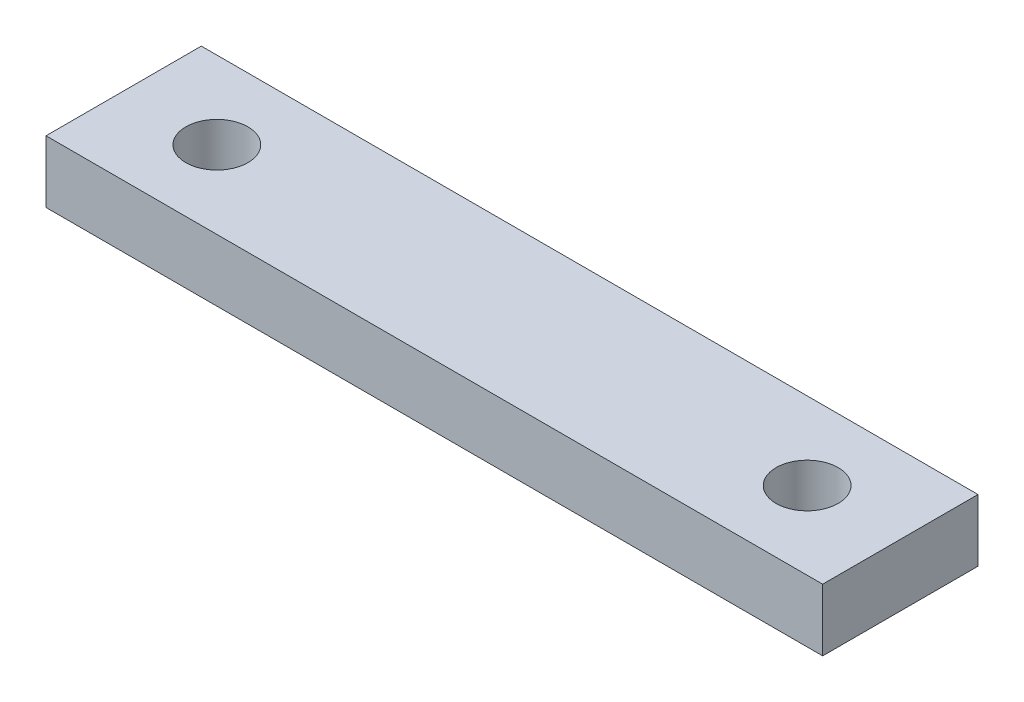
ISO-10303-21;
HEADER;
FILE_DESCRIPTION(('STEP AP214'),'2;1');
FILE_NAME('part.step','',(''),(''),'','','');
FILE_SCHEMA(('AUTOMOTIVE_DESIGN { 1 0 10303 214 1 1 1 1 }'));
ENDSEC;
DATA;
#1=APPLICATION_CONTEXT('core data for automotive mechanical design processes');
#2=APPLICATION_PROTOCOL_DEFINITION('international standard','automotive_design',2000,#1);
#3=PRODUCT_CONTEXT('',#1,'mechanical');
#4=PRODUCT('Part','Part','',(#3));
#5=PRODUCT_RELATED_PRODUCT_CATEGORY('part','',(#4));
#6=PRODUCT_DEFINITION_FORMATION('','',#4);
#7=PRODUCT_DEFINITION_CONTEXT('part definition',#1,'design');
#8=PRODUCT_DEFINITION('design','',#6,#7);
#9=PRODUCT_DEFINITION_SHAPE('','',#8);
#10=(LENGTH_UNIT() NAMED_UNIT(*) SI_UNIT(.MILLI.,.METRE.));
#11=(NAMED_UNIT(*) PLANE_ANGLE_UNIT() SI_UNIT($,.RADIAN.));
#12=(NAMED_UNIT(*) SI_UNIT($,.STERADIAN.) SOLID_ANGLE_UNIT());
#13=UNCERTAINTY_MEASURE_WITH_UNIT(LENGTH_MEASURE(1.E-05),#10,'distance_accuracy_value','');
#14=(GEOMETRIC_REPRESENTATION_CONTEXT(3) GLOBAL_UNCERTAINTY_ASSIGNED_CONTEXT((#13)) GLOBAL_UNIT_ASSIGNED_CONTEXT((#10,
#11,#12)) REPRESENTATION_CONTEXT('',''));
#15=CARTESIAN_POINT('',(0.,0.,0.));
#16=DIRECTION('',(0.,0.,1.));
#17=DIRECTION('',(1.,0.,0.));
#18=AXIS2_PLACEMENT_3D('',#15,#16,#17);
#19=CARTESIAN_POINT('',(0.,4.,0.));
#20=DIRECTION('',(0.,-1.,0.));
#21=DIRECTION('',(0.,0.,-1.));
#22=AXIS2_PLACEMENT_3D('',#19,#20,#21);
#23=PLANE('',#22);
#24=DIRECTION('',(0.,0.,-1.));
#25=VECTOR('',#24,1.);
#26=CARTESIAN_POINT('',(25.,4.,5.));
#27=LINE('',#26,#25);
#28=CARTESIAN_POINT('',(25.,4.,5.));
#29=VERTEX_POINT('',#28);
#30=CARTESIAN_POINT('',(25.,4.,-5.));
#31=VERTEX_POINT('',#30);
#32=EDGE_CURVE('E92',#29,#31,#27,.T.);
#33=ORIENTED_EDGE('',*,*,#32,.T.);
#34=DIRECTION('',(-1.,0.,0.));
#35=VECTOR('',#34,1.);
#36=CARTESIAN_POINT('',(-25.,4.,-5.));
#37=LINE('',#36,#35);
#38=CARTESIAN_POINT('',(-25.,4.,-5.));
#39=VERTEX_POINT('',#38);
#40=EDGE_CURVE('E87',#31,#39,#37,.T.);
#41=ORIENTED_EDGE('',*,*,#40,.T.);
#42=DIRECTION('',(0.,0.,1.));
#43=VECTOR('',#42,1.);
#44=CARTESIAN_POINT('',(-25.,4.,5.));
#45=LINE('',#44,#43);
#46=CARTESIAN_POINT('',(-25.,4.,5.));
#47=VERTEX_POINT('',#46);
#48=EDGE_CURVE('E90',#39,#47,#45,.T.);
#49=ORIENTED_EDGE('',*,*,#48,.T.);
#50=DIRECTION('',(1.,0.,0.));
#51=VECTOR('',#50,1.);
#52=CARTESIAN_POINT('',(-25.,4.,5.));
#53=LINE('',#52,#51);
#54=EDGE_CURVE('E57',#47,#29,#53,.T.);
#55=ORIENTED_EDGE('',*,*,#54,.T.);
#56=EDGE_LOOP('',(#33,#41,#49,#55));
#57=FACE_BOUND('',#56,.T.);
#58=CARTESIAN_POINT('',(19.,4.,0.));
#59=DIRECTION('',(0.,1.,0.));
#60=DIRECTION('',(0.,0.,1.));
#61=AXIS2_PLACEMENT_3D('',#58,#59,#60);
#62=CIRCLE('',#61,2.);
#63=CARTESIAN_POINT('',(19.,4.,2.));
#64=VERTEX_POINT('',#63);
#65=EDGE_CURVE('E112',#64,#64,#62,.T.);
#66=ORIENTED_EDGE('',*,*,#65,.F.);
#67=EDGE_LOOP('',(#66));
#68=FACE_BOUND('',#67,.T.);
#69=CARTESIAN_POINT('',(-19.,4.,0.));
#70=DIRECTION('',(0.,1.,0.));
#71=DIRECTION('',(0.,0.,-1.));
#72=AXIS2_PLACEMENT_3D('',#69,#70,#71);
#73=CIRCLE('',#72,2.);
#74=CARTESIAN_POINT('',(-19.,4.,-2.));
#75=VERTEX_POINT('',#74);
#76=EDGE_CURVE('E134',#75,#75,#73,.T.);
#77=ORIENTED_EDGE('',*,*,#76,.F.);
#78=EDGE_LOOP('',(#77));
#79=FACE_BOUND('',#78,.T.);
#80=ADVANCED_FACE('F39',(#57,#68,#79),#23,.F.);
#81=CARTESIAN_POINT('',(0.,0.,0.));
#82=DIRECTION('',(0.,-1.,0.));
#83=DIRECTION('',(0.,0.,-1.));
#84=AXIS2_PLACEMENT_3D('',#81,#82,#83);
#85=PLANE('',#84);
#86=CARTESIAN_POINT('',(19.,0.,0.));
#87=DIRECTION('',(0.,1.,0.));
#88=DIRECTION('',(0.,0.,1.));
#89=AXIS2_PLACEMENT_3D('',#86,#87,#88);
#90=CIRCLE('',#89,2.);
#91=CARTESIAN_POINT('',(19.,0.,2.));
#92=VERTEX_POINT('',#91);
#93=EDGE_CURVE('E130',#92,#92,#90,.T.);
#94=ORIENTED_EDGE('',*,*,#93,.T.);
#95=EDGE_LOOP('',(#94));
#96=FACE_BOUND('',#95,.T.);
#97=DIRECTION('',(0.,0.,-1.));
#98=VECTOR('',#97,1.);
#99=CARTESIAN_POINT('',(25.,0.,5.));
#100=LINE('',#99,#98);
#101=CARTESIAN_POINT('',(25.,0.,5.));
#102=VERTEX_POINT('',#101);
#103=CARTESIAN_POINT('',(25.,0.,-5.));
#104=VERTEX_POINT('',#103);
#105=EDGE_CURVE('E108',#102,#104,#100,.T.);
#106=ORIENTED_EDGE('',*,*,#105,.F.);
#107=DIRECTION('',(1.,0.,0.));
#108=VECTOR('',#107,1.);
#109=CARTESIAN_POINT('',(-25.,0.,5.));
#110=LINE('',#109,#108);
#111=CARTESIAN_POINT('',(-25.,0.,5.));
#112=VERTEX_POINT('',#111);
#113=EDGE_CURVE('E80',#112,#102,#110,.T.);
#114=ORIENTED_EDGE('',*,*,#113,.F.);
#115=DIRECTION('',(0.,0.,1.));
#116=VECTOR('',#115,1.);
#117=CARTESIAN_POINT('',(-25.,0.,5.));
#118=LINE('',#117,#116);
#119=CARTESIAN_POINT('',(-25.,0.,-5.));
#120=VERTEX_POINT('',#119);
#121=EDGE_CURVE('E74',#120,#112,#118,.T.);
#122=ORIENTED_EDGE('',*,*,#121,.F.);
#123=DIRECTION('',(-1.,0.,0.));
#124=VECTOR('',#123,1.);
#125=CARTESIAN_POINT('',(-25.,0.,-5.));
#126=LINE('',#125,#124);
#127=EDGE_CURVE('E97',#104,#120,#126,.T.);
#128=ORIENTED_EDGE('',*,*,#127,.F.);
#129=EDGE_LOOP('',(#106,#114,#122,#128));
#130=FACE_BOUND('',#129,.T.);
#131=CARTESIAN_POINT('',(-19.,0.,0.));
#132=DIRECTION('',(0.,1.,0.));
#133=DIRECTION('',(0.,0.,-1.));
#134=AXIS2_PLACEMENT_3D('',#131,#132,#133);
#135=CIRCLE('',#134,2.);
#136=CARTESIAN_POINT('',(-19.,0.,-2.));
#137=VERTEX_POINT('',#136);
#138=EDGE_CURVE('E138',#137,#137,#135,.T.);
#139=ORIENTED_EDGE('',*,*,#138,.T.);
#140=EDGE_LOOP('',(#139));
#141=FACE_BOUND('',#140,.T.);
#142=ADVANCED_FACE('F125',(#96,#130,#141),#85,.T.);
#143=CARTESIAN_POINT('',(25.,4.,5.));
#144=DIRECTION('',(-1.,0.,0.));
#145=DIRECTION('',(0.,0.,1.));
#146=AXIS2_PLACEMENT_3D('',#143,#144,#145);
#147=PLANE('',#146);
#148=ORIENTED_EDGE('',*,*,#105,.T.);
#149=DIRECTION('',(0.,-1.,0.));
#150=VECTOR('',#149,1.);
#151=CARTESIAN_POINT('',(25.,4.,-5.));
#152=LINE('',#151,#150);
#153=EDGE_CURVE('E11',#31,#104,#152,.T.);
#154=ORIENTED_EDGE('',*,*,#153,.F.);
#155=ORIENTED_EDGE('',*,*,#32,.F.);
#156=DIRECTION('',(0.,-1.,0.));
#157=VECTOR('',#156,1.);
#158=CARTESIAN_POINT('',(25.,4.,5.));
#159=LINE('',#158,#157);
#160=EDGE_CURVE('E104',#29,#102,#159,.T.);
#161=ORIENTED_EDGE('',*,*,#160,.T.);
#162=EDGE_LOOP('',(#148,#154,#155,#161));
#163=FACE_BOUND('',#162,.T.);
#164=ADVANCED_FACE('F41',(#163),#147,.F.);
#165=CARTESIAN_POINT('',(-25.,4.,-5.));
#166=DIRECTION('',(0.,0.,1.));
#167=DIRECTION('',(1.,0.,0.));
#168=AXIS2_PLACEMENT_3D('',#165,#166,#167);
#169=PLANE('',#168);
#170=ORIENTED_EDGE('',*,*,#127,.T.);
#171=DIRECTION('',(0.,-1.,0.));
#172=VECTOR('',#171,1.);
#173=CARTESIAN_POINT('',(-25.,4.,-5.));
#174=LINE('',#173,#172);
#175=EDGE_CURVE('E49',#39,#120,#174,.T.);
#176=ORIENTED_EDGE('',*,*,#175,.F.);
#177=ORIENTED_EDGE('',*,*,#40,.F.);
#178=ORIENTED_EDGE('',*,*,#153,.T.);
#179=EDGE_LOOP('',(#170,#176,#177,#178));
#180=FACE_BOUND('',#179,.T.);
#181=ADVANCED_FACE('F96',(#180),#169,.F.);
#182=CARTESIAN_POINT('',(-25.,4.,5.));
#183=DIRECTION('',(1.,0.,0.));
#184=DIRECTION('',(0.,0.,-1.));
#185=AXIS2_PLACEMENT_3D('',#182,#183,#184);
#186=PLANE('',#185);
#187=ORIENTED_EDGE('',*,*,#121,.T.);
#188=DIRECTION('',(0.,-1.,0.));
#189=VECTOR('',#188,1.);
#190=CARTESIAN_POINT('',(-25.,4.,5.));
#191=LINE('',#190,#189);
#192=EDGE_CURVE('E99',#47,#112,#191,.T.);
#193=ORIENTED_EDGE('',*,*,#192,.F.);
#194=ORIENTED_EDGE('',*,*,#48,.F.);
#195=ORIENTED_EDGE('',*,*,#175,.T.);
#196=EDGE_LOOP('',(#187,#193,#194,#195));
#197=FACE_BOUND('',#196,.T.);
#198=ADVANCED_FACE('F100',(#197),#186,.F.);
#199=CARTESIAN_POINT('',(-25.,4.,5.));
#200=DIRECTION('',(0.,0.,-1.));
#201=DIRECTION('',(-1.,0.,0.));
#202=AXIS2_PLACEMENT_3D('',#199,#200,#201);
#203=PLANE('',#202);
#204=ORIENTED_EDGE('',*,*,#113,.T.);
#205=ORIENTED_EDGE('',*,*,#160,.F.);
#206=ORIENTED_EDGE('',*,*,#54,.F.);
#207=ORIENTED_EDGE('',*,*,#192,.T.);
#208=EDGE_LOOP('',(#204,#205,#206,#207));
#209=FACE_BOUND('',#208,.T.);
#210=ADVANCED_FACE('F122',(#209),#203,.F.);
#211=CARTESIAN_POINT('',(19.,4.,0.));
#212=DIRECTION('',(0.,-1.,0.));
#213=DIRECTION('',(0.,0.,-1.));
#214=AXIS2_PLACEMENT_3D('',#211,#212,#213);
#215=CYLINDRICAL_SURFACE('',#214,2.);
#216=ORIENTED_EDGE('',*,*,#65,.T.);
#217=EDGE_LOOP('',(#216));
#218=FACE_BOUND('',#217,.T.);
#219=ORIENTED_EDGE('',*,*,#93,.F.);
#220=EDGE_LOOP('',(#219));
#221=FACE_BOUND('',#220,.T.);
#222=ADVANCED_FACE('F157',(#218,#221),#215,.F.);
#223=CARTESIAN_POINT('',(-19.,4.,0.));
#224=DIRECTION('',(0.,-1.,0.));
#225=DIRECTION('',(0.,0.,-1.));
#226=AXIS2_PLACEMENT_3D('',#223,#224,#225);
#227=CYLINDRICAL_SURFACE('',#226,2.);
#228=ORIENTED_EDGE('',*,*,#76,.T.);
#229=EDGE_LOOP('',(#228));
#230=FACE_BOUND('',#229,.T.);
#231=ORIENTED_EDGE('',*,*,#138,.F.);
#232=EDGE_LOOP('',(#231));
#233=FACE_BOUND('',#232,.T.);
#234=ADVANCED_FACE('F146',(#230,#233),#227,.F.);
#235=CLOSED_SHELL('',(#80,#142,#164,#181,#198,#210,#222,#234));
#236=MANIFOLD_SOLID_BREP('B2',#235);
#237=ADVANCED_BREP_SHAPE_REPRESENTATION('',(#18,#236),#14);
#238=SHAPE_DEFINITION_REPRESENTATION(#9,#237);
ENDSEC;
END-ISO-10303-21;
